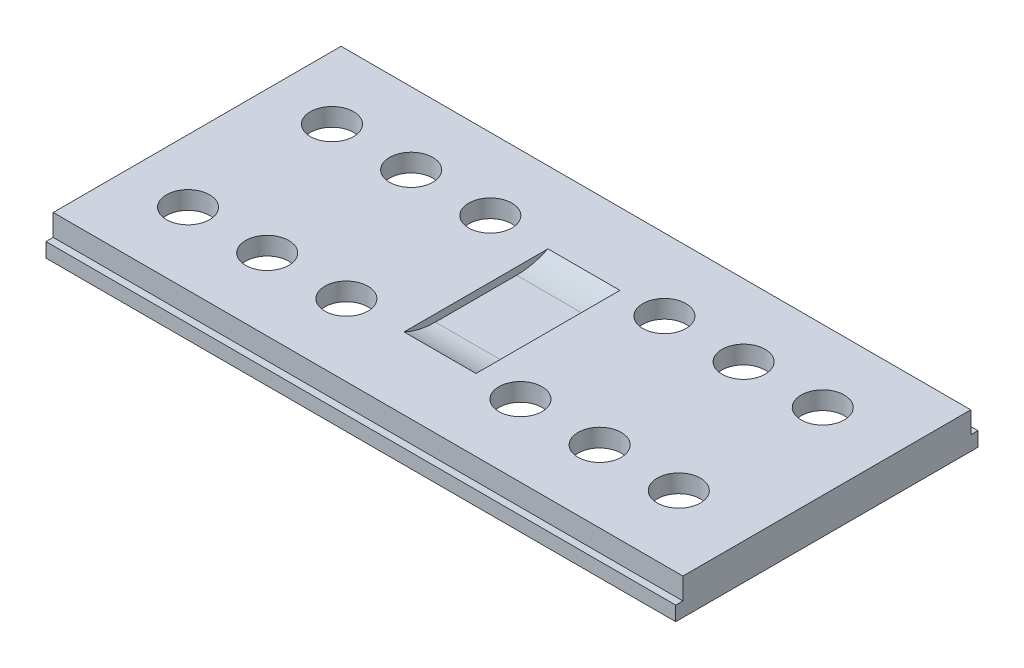
ISO-10303-21;
HEADER;
FILE_DESCRIPTION(('STEP AP214'),'2;1');
FILE_NAME('part.step','',(''),(''),'','','');
FILE_SCHEMA(('AUTOMOTIVE_DESIGN { 1 0 10303 214 1 1 1 1 }'));
ENDSEC;
DATA;
#1=APPLICATION_CONTEXT('core data for automotive mechanical design processes');
#2=APPLICATION_PROTOCOL_DEFINITION('international standard','automotive_design',2000,#1);
#3=PRODUCT_CONTEXT('',#1,'mechanical');
#4=PRODUCT('Part','Part','',(#3));
#5=PRODUCT_RELATED_PRODUCT_CATEGORY('part','',(#4));
#6=PRODUCT_DEFINITION_FORMATION('','',#4);
#7=PRODUCT_DEFINITION_CONTEXT('part definition',#1,'design');
#8=PRODUCT_DEFINITION('design','',#6,#7);
#9=PRODUCT_DEFINITION_SHAPE('','',#8);
#10=(LENGTH_UNIT() NAMED_UNIT(*) SI_UNIT(.MILLI.,.METRE.));
#11=(NAMED_UNIT(*) PLANE_ANGLE_UNIT() SI_UNIT($,.RADIAN.));
#12=(NAMED_UNIT(*) SI_UNIT($,.STERADIAN.) SOLID_ANGLE_UNIT());
#13=UNCERTAINTY_MEASURE_WITH_UNIT(LENGTH_MEASURE(1.E-05),#10,'distance_accuracy_value','');
#14=(GEOMETRIC_REPRESENTATION_CONTEXT(3) GLOBAL_UNCERTAINTY_ASSIGNED_CONTEXT((#13)) GLOBAL_UNIT_ASSIGNED_CONTEXT((#10,
#11,#12)) REPRESENTATION_CONTEXT('',''));
#15=CARTESIAN_POINT('',(0.,0.,0.));
#16=DIRECTION('',(0.,0.,1.));
#17=DIRECTION('',(1.,0.,0.));
#18=AXIS2_PLACEMENT_3D('',#15,#16,#17);
#19=CARTESIAN_POINT('',(33.1768874396976,2.5,-10.));
#20=DIRECTION('',(0.,1.,0.));
#21=DIRECTION('',(0.,0.,1.));
#22=AXIS2_PLACEMENT_3D('',#19,#20,#21);
#23=CYLINDRICAL_SURFACE('',#22,3.);
#24=CARTESIAN_POINT('',(33.1768874396976,2.5,-10.));
#25=DIRECTION('',(0.,1.,0.));
#26=DIRECTION('',(0.,0.,1.));
#27=AXIS2_PLACEMENT_3D('',#24,#25,#26);
#28=CIRCLE('',#27,3.);
#29=CARTESIAN_POINT('',(33.1768874396976,2.5,-7.));
#30=VERTEX_POINT('',#29);
#31=EDGE_CURVE('E41',#30,#30,#28,.T.);
#32=ORIENTED_EDGE('',*,*,#31,.F.);
#33=EDGE_LOOP('',(#32));
#34=FACE_BOUND('',#33,.T.);
#35=CARTESIAN_POINT('',(33.1768874396976,5.,-10.));
#36=DIRECTION('',(0.,1.,0.));
#37=DIRECTION('',(0.,0.,1.));
#38=AXIS2_PLACEMENT_3D('',#35,#36,#37);
#39=CIRCLE('',#38,3.);
#40=CARTESIAN_POINT('',(33.1768874396976,5.,-7.));
#41=VERTEX_POINT('',#40);
#42=EDGE_CURVE('E11',#41,#41,#39,.T.);
#43=ORIENTED_EDGE('',*,*,#42,.T.);
#44=EDGE_LOOP('',(#43));
#45=FACE_BOUND('',#44,.T.);
#46=ADVANCED_FACE('F34',(#34,#45),#23,.F.);
#47=CARTESIAN_POINT('',(33.1768874396976,2.5,10.));
#48=DIRECTION('',(0.,1.,0.));
#49=DIRECTION('',(0.,0.,1.));
#50=AXIS2_PLACEMENT_3D('',#47,#48,#49);
#51=CYLINDRICAL_SURFACE('',#50,3.);
#52=CARTESIAN_POINT('',(33.1768874396976,2.5,10.));
#53=DIRECTION('',(0.,1.,0.));
#54=DIRECTION('',(0.,0.,1.));
#55=AXIS2_PLACEMENT_3D('',#52,#53,#54);
#56=CIRCLE('',#55,3.);
#57=CARTESIAN_POINT('',(33.1768874396976,2.5,13.));
#58=VERTEX_POINT('',#57);
#59=EDGE_CURVE('E331',#58,#58,#56,.T.);
#60=ORIENTED_EDGE('',*,*,#59,.F.);
#61=EDGE_LOOP('',(#60));
#62=FACE_BOUND('',#61,.T.);
#63=CARTESIAN_POINT('',(33.1768874396976,5.,10.));
#64=DIRECTION('',(0.,1.,0.));
#65=DIRECTION('',(0.,0.,1.));
#66=AXIS2_PLACEMENT_3D('',#63,#64,#65);
#67=CIRCLE('',#66,3.);
#68=CARTESIAN_POINT('',(33.1768874396976,5.,13.));
#69=VERTEX_POINT('',#68);
#70=EDGE_CURVE('E334',#69,#69,#67,.T.);
#71=ORIENTED_EDGE('',*,*,#70,.T.);
#72=EDGE_LOOP('',(#71));
#73=FACE_BOUND('',#72,.T.);
#74=ADVANCED_FACE('F342',(#62,#73),#51,.F.);
#75=CARTESIAN_POINT('',(-13.0132960899572,2.5,-10.));
#76=DIRECTION('',(0.,1.,0.));
#77=DIRECTION('',(0.,0.,1.));
#78=AXIS2_PLACEMENT_3D('',#75,#76,#77);
#79=CYLINDRICAL_SURFACE('',#78,3.);
#80=CARTESIAN_POINT('',(-13.0132960899572,2.5,-10.));
#81=DIRECTION('',(0.,1.,0.));
#82=DIRECTION('',(0.,0.,1.));
#83=AXIS2_PLACEMENT_3D('',#80,#81,#82);
#84=CIRCLE('',#83,3.);
#85=CARTESIAN_POINT('',(-13.0132960899572,2.5,-7.));
#86=VERTEX_POINT('',#85);
#87=EDGE_CURVE('E325',#86,#86,#84,.T.);
#88=ORIENTED_EDGE('',*,*,#87,.F.);
#89=EDGE_LOOP('',(#88));
#90=FACE_BOUND('',#89,.T.);
#91=CARTESIAN_POINT('',(-13.0132960899572,5.,-10.));
#92=DIRECTION('',(0.,1.,0.));
#93=DIRECTION('',(0.,0.,1.));
#94=AXIS2_PLACEMENT_3D('',#91,#92,#93);
#95=CIRCLE('',#94,3.);
#96=CARTESIAN_POINT('',(-13.0132960899572,5.,-7.));
#97=VERTEX_POINT('',#96);
#98=EDGE_CURVE('E328',#97,#97,#95,.T.);
#99=ORIENTED_EDGE('',*,*,#98,.T.);
#100=EDGE_LOOP('',(#99));
#101=FACE_BOUND('',#100,.T.);
#102=ADVANCED_FACE('F389',(#90,#101),#79,.F.);
#103=CARTESIAN_POINT('',(-13.0132960899572,2.5,10.));
#104=DIRECTION('',(0.,1.,0.));
#105=DIRECTION('',(0.,0.,1.));
#106=AXIS2_PLACEMENT_3D('',#103,#104,#105);
#107=CYLINDRICAL_SURFACE('',#106,3.);
#108=CARTESIAN_POINT('',(-13.0132960899572,2.5,10.));
#109=DIRECTION('',(0.,1.,0.));
#110=DIRECTION('',(0.,0.,1.));
#111=AXIS2_PLACEMENT_3D('',#108,#109,#110);
#112=CIRCLE('',#111,3.);
#113=CARTESIAN_POINT('',(-13.0132960899572,2.5,13.));
#114=VERTEX_POINT('',#113);
#115=EDGE_CURVE('E319',#114,#114,#112,.T.);
#116=ORIENTED_EDGE('',*,*,#115,.F.);
#117=EDGE_LOOP('',(#116));
#118=FACE_BOUND('',#117,.T.);
#119=CARTESIAN_POINT('',(-13.0132960899572,5.,10.));
#120=DIRECTION('',(0.,1.,0.));
#121=DIRECTION('',(0.,0.,1.));
#122=AXIS2_PLACEMENT_3D('',#119,#120,#121);
#123=CIRCLE('',#122,3.);
#124=CARTESIAN_POINT('',(-13.0132960899572,5.,13.));
#125=VERTEX_POINT('',#124);
#126=EDGE_CURVE('E322',#125,#125,#123,.T.);
#127=ORIENTED_EDGE('',*,*,#126,.T.);
#128=EDGE_LOOP('',(#127));
#129=FACE_BOUND('',#128,.T.);
#130=ADVANCED_FACE('F376',(#118,#129),#107,.F.);
#131=CARTESIAN_POINT('',(43.75,5.,-21.));
#132=DIRECTION('',(-1.,0.,0.));
#133=DIRECTION('',(0.,0.,1.));
#134=AXIS2_PLACEMENT_3D('',#131,#132,#133);
#135=PLANE('',#134);
#136=DIRECTION('',(0.,0.,-1.));
#137=VECTOR('',#136,1.);
#138=CARTESIAN_POINT('',(43.75,5.,-21.));
#139=LINE('',#138,#137);
#140=CARTESIAN_POINT('',(43.75,5.,20.));
#141=VERTEX_POINT('',#140);
#142=CARTESIAN_POINT('',(43.75,5.,-20.));
#143=VERTEX_POINT('',#142);
#144=EDGE_CURVE('E281',#141,#143,#139,.T.);
#145=ORIENTED_EDGE('',*,*,#144,.F.);
#146=DIRECTION('',(0.,1.,0.));
#147=VECTOR('',#146,1.);
#148=CARTESIAN_POINT('',(43.75,2.,20.));
#149=LINE('',#148,#147);
#150=CARTESIAN_POINT('',(43.75,2.,20.));
#151=VERTEX_POINT('',#150);
#152=EDGE_CURVE('E257',#151,#141,#149,.T.);
#153=ORIENTED_EDGE('',*,*,#152,.F.);
#154=DIRECTION('',(0.,0.,-1.));
#155=VECTOR('',#154,1.);
#156=CARTESIAN_POINT('',(43.75,2.,21.));
#157=LINE('',#156,#155);
#158=CARTESIAN_POINT('',(43.75,2.,21.));
#159=VERTEX_POINT('',#158);
#160=EDGE_CURVE('E252',#159,#151,#157,.T.);
#161=ORIENTED_EDGE('',*,*,#160,.F.);
#162=DIRECTION('',(0.,-1.,0.));
#163=VECTOR('',#162,1.);
#164=CARTESIAN_POINT('',(43.75,5.,21.));
#165=LINE('',#164,#163);
#166=CARTESIAN_POINT('',(43.75,0.,21.));
#167=VERTEX_POINT('',#166);
#168=EDGE_CURVE('E287',#159,#167,#165,.T.);
#169=ORIENTED_EDGE('',*,*,#168,.T.);
#170=DIRECTION('',(0.,0.,-1.));
#171=VECTOR('',#170,1.);
#172=CARTESIAN_POINT('',(43.75,0.,-21.));
#173=LINE('',#172,#171);
#174=CARTESIAN_POINT('',(43.75,0.,-21.));
#175=VERTEX_POINT('',#174);
#176=EDGE_CURVE('E279',#167,#175,#173,.T.);
#177=ORIENTED_EDGE('',*,*,#176,.T.);
#178=DIRECTION('',(0.,-1.,0.));
#179=VECTOR('',#178,1.);
#180=CARTESIAN_POINT('',(43.75,5.,-21.));
#181=LINE('',#180,#179);
#182=CARTESIAN_POINT('',(43.75,2.,-21.));
#183=VERTEX_POINT('',#182);
#184=EDGE_CURVE('E303',#183,#175,#181,.T.);
#185=ORIENTED_EDGE('',*,*,#184,.F.);
#186=DIRECTION('',(0.,0.,-1.));
#187=VECTOR('',#186,1.);
#188=CARTESIAN_POINT('',(43.75,2.,-21.));
#189=LINE('',#188,#187);
#190=CARTESIAN_POINT('',(43.75,2.,-20.));
#191=VERTEX_POINT('',#190);
#192=EDGE_CURVE('E264',#191,#183,#189,.T.);
#193=ORIENTED_EDGE('',*,*,#192,.F.);
#194=DIRECTION('',(0.,1.,0.));
#195=VECTOR('',#194,1.);
#196=CARTESIAN_POINT('',(43.75,2.,-20.));
#197=LINE('',#196,#195);
#198=EDGE_CURVE('E276',#191,#143,#197,.T.);
#199=ORIENTED_EDGE('',*,*,#198,.T.);
#200=EDGE_LOOP('',(#145,#153,#161,#169,#177,#185,#193,#199));
#201=FACE_BOUND('',#200,.T.);
#202=ADVANCED_FACE('F372',(#201),#135,.F.);
#203=CARTESIAN_POINT('',(-43.75,5.,-21.));
#204=DIRECTION('',(0.,0.,1.));
#205=DIRECTION('',(1.,0.,0.));
#206=AXIS2_PLACEMENT_3D('',#203,#204,#205);
#207=PLANE('',#206);
#208=DIRECTION('',(0.,-1.,0.));
#209=VECTOR('',#208,1.);
#210=CARTESIAN_POINT('',(-43.75,5.,-21.));
#211=LINE('',#210,#209);
#212=CARTESIAN_POINT('',(-43.75,2.,-21.));
#213=VERTEX_POINT('',#212);
#214=CARTESIAN_POINT('',(-43.75,0.,-21.));
#215=VERTEX_POINT('',#214);
#216=EDGE_CURVE('E301',#213,#215,#211,.T.);
#217=ORIENTED_EDGE('',*,*,#216,.F.);
#218=DIRECTION('',(-1.,0.,0.));
#219=VECTOR('',#218,1.);
#220=CARTESIAN_POINT('',(43.75,2.,-21.));
#221=LINE('',#220,#219);
#222=EDGE_CURVE('E266',#183,#213,#221,.T.);
#223=ORIENTED_EDGE('',*,*,#222,.F.);
#224=ORIENTED_EDGE('',*,*,#184,.T.);
#225=DIRECTION('',(-1.,0.,0.));
#226=VECTOR('',#225,1.);
#227=CARTESIAN_POINT('',(-43.75,0.,-21.));
#228=LINE('',#227,#226);
#229=EDGE_CURVE('E290',#175,#215,#228,.T.);
#230=ORIENTED_EDGE('',*,*,#229,.T.);
#231=EDGE_LOOP('',(#217,#223,#224,#230));
#232=FACE_BOUND('',#231,.T.);
#233=ADVANCED_FACE('F368',(#232),#207,.F.);
#234=CARTESIAN_POINT('',(-43.75,5.,-21.));
#235=DIRECTION('',(1.,0.,0.));
#236=DIRECTION('',(0.,0.,-1.));
#237=AXIS2_PLACEMENT_3D('',#234,#235,#236);
#238=PLANE('',#237);
#239=DIRECTION('',(0.,0.,1.));
#240=VECTOR('',#239,1.);
#241=CARTESIAN_POINT('',(-43.75,2.,21.));
#242=LINE('',#241,#240);
#243=CARTESIAN_POINT('',(-43.75,2.,20.));
#244=VERTEX_POINT('',#243);
#245=CARTESIAN_POINT('',(-43.75,2.,21.));
#246=VERTEX_POINT('',#245);
#247=EDGE_CURVE('E248',#244,#246,#242,.T.);
#248=ORIENTED_EDGE('',*,*,#247,.F.);
#249=DIRECTION('',(0.,1.,0.));
#250=VECTOR('',#249,1.);
#251=CARTESIAN_POINT('',(-43.75,2.,20.));
#252=LINE('',#251,#250);
#253=CARTESIAN_POINT('',(-43.75,5.,20.));
#254=VERTEX_POINT('',#253);
#255=EDGE_CURVE('E259',#244,#254,#252,.T.);
#256=ORIENTED_EDGE('',*,*,#255,.T.);
#257=DIRECTION('',(0.,0.,1.));
#258=VECTOR('',#257,1.);
#259=CARTESIAN_POINT('',(-43.75,5.,-21.));
#260=LINE('',#259,#258);
#261=CARTESIAN_POINT('',(-43.75,5.,-20.));
#262=VERTEX_POINT('',#261);
#263=EDGE_CURVE('E283',#262,#254,#260,.T.);
#264=ORIENTED_EDGE('',*,*,#263,.F.);
#265=DIRECTION('',(0.,1.,0.));
#266=VECTOR('',#265,1.);
#267=CARTESIAN_POINT('',(-43.75,2.,-20.));
#268=LINE('',#267,#266);
#269=CARTESIAN_POINT('',(-43.75,2.,-20.));
#270=VERTEX_POINT('',#269);
#271=EDGE_CURVE('E273',#270,#262,#268,.T.);
#272=ORIENTED_EDGE('',*,*,#271,.F.);
#273=DIRECTION('',(0.,0.,1.));
#274=VECTOR('',#273,1.);
#275=CARTESIAN_POINT('',(-43.75,2.,-21.));
#276=LINE('',#275,#274);
#277=EDGE_CURVE('E268',#213,#270,#276,.T.);
#278=ORIENTED_EDGE('',*,*,#277,.F.);
#279=ORIENTED_EDGE('',*,*,#216,.T.);
#280=DIRECTION('',(0.,0.,1.));
#281=VECTOR('',#280,1.);
#282=CARTESIAN_POINT('',(-43.75,0.,-21.));
#283=LINE('',#282,#281);
#284=CARTESIAN_POINT('',(-43.75,0.,21.));
#285=VERTEX_POINT('',#284);
#286=EDGE_CURVE('E293',#215,#285,#283,.T.);
#287=ORIENTED_EDGE('',*,*,#286,.T.);
#288=DIRECTION('',(0.,-1.,0.));
#289=VECTOR('',#288,1.);
#290=CARTESIAN_POINT('',(-43.75,5.,21.));
#291=LINE('',#290,#289);
#292=EDGE_CURVE('E299',#246,#285,#291,.T.);
#293=ORIENTED_EDGE('',*,*,#292,.F.);
#294=EDGE_LOOP('',(#248,#256,#264,#272,#278,#279,#287,#293));
#295=FACE_BOUND('',#294,.T.);
#296=ADVANCED_FACE('F358',(#295),#238,.F.);
#297=CARTESIAN_POINT('',(-43.75,5.,21.));
#298=DIRECTION('',(0.,0.,-1.));
#299=DIRECTION('',(-1.,0.,0.));
#300=AXIS2_PLACEMENT_3D('',#297,#298,#299);
#301=PLANE('',#300);
#302=ORIENTED_EDGE('',*,*,#168,.F.);
#303=DIRECTION('',(1.,0.,0.));
#304=VECTOR('',#303,1.);
#305=CARTESIAN_POINT('',(-43.75,2.,21.));
#306=LINE('',#305,#304);
#307=EDGE_CURVE('E250',#246,#159,#306,.T.);
#308=ORIENTED_EDGE('',*,*,#307,.F.);
#309=ORIENTED_EDGE('',*,*,#292,.T.);
#310=DIRECTION('',(1.,0.,0.));
#311=VECTOR('',#310,1.);
#312=CARTESIAN_POINT('',(-43.75,0.,21.));
#313=LINE('',#312,#311);
#314=EDGE_CURVE('E284',#285,#167,#313,.T.);
#315=ORIENTED_EDGE('',*,*,#314,.T.);
#316=EDGE_LOOP('',(#302,#308,#309,#315));
#317=FACE_BOUND('',#316,.T.);
#318=ADVANCED_FACE('F348',(#317),#301,.F.);
#319=CARTESIAN_POINT('',(0.,5.,0.));
#320=DIRECTION('',(0.,1.,0.));
#321=DIRECTION('',(0.,0.,1.));
#322=AXIS2_PLACEMENT_3D('',#319,#320,#321);
#323=PLANE('',#322);
#324=CARTESIAN_POINT('',(22.1768874396976,5.,-10.));
#325=DIRECTION('',(0.,1.,0.));
#326=DIRECTION('',(0.,0.,1.));
#327=AXIS2_PLACEMENT_3D('',#324,#325,#326);
#328=CIRCLE('',#327,3.);
#329=CARTESIAN_POINT('',(22.1768874396976,5.,-7.));
#330=VERTEX_POINT('',#329);
#331=EDGE_CURVE('E840',#330,#330,#328,.T.);
#332=ORIENTED_EDGE('',*,*,#331,.F.);
#333=EDGE_LOOP('',(#332));
#334=FACE_BOUND('',#333,.T.);
#335=CARTESIAN_POINT('',(22.1768874396976,5.,10.));
#336=DIRECTION('',(0.,1.,0.));
#337=DIRECTION('',(0.,0.,1.));
#338=AXIS2_PLACEMENT_3D('',#335,#336,#337);
#339=CIRCLE('',#338,3.);
#340=CARTESIAN_POINT('',(22.1768874396976,5.,13.));
#341=VERTEX_POINT('',#340);
#342=EDGE_CURVE('E834',#341,#341,#339,.T.);
#343=ORIENTED_EDGE('',*,*,#342,.F.);
#344=EDGE_LOOP('',(#343));
#345=FACE_BOUND('',#344,.T.);
#346=CARTESIAN_POINT('',(-24.0132960899572,5.,-10.));
#347=DIRECTION('',(0.,1.,0.));
#348=DIRECTION('',(0.,0.,1.));
#349=AXIS2_PLACEMENT_3D('',#346,#347,#348);
#350=CIRCLE('',#349,3.);
#351=CARTESIAN_POINT('',(-24.0132960899572,5.,-7.));
#352=VERTEX_POINT('',#351);
#353=EDGE_CURVE('E828',#352,#352,#350,.T.);
#354=ORIENTED_EDGE('',*,*,#353,.F.);
#355=EDGE_LOOP('',(#354));
#356=FACE_BOUND('',#355,.T.);
#357=CARTESIAN_POINT('',(-24.0132960899572,5.,10.));
#358=DIRECTION('',(0.,1.,0.));
#359=DIRECTION('',(0.,0.,1.));
#360=AXIS2_PLACEMENT_3D('',#357,#358,#359);
#361=CIRCLE('',#360,3.);
#362=CARTESIAN_POINT('',(-24.0132960899572,5.,13.));
#363=VERTEX_POINT('',#362);
#364=EDGE_CURVE('E820',#363,#363,#361,.T.);
#365=ORIENTED_EDGE('',*,*,#364,.F.);
#366=EDGE_LOOP('',(#365));
#367=FACE_BOUND('',#366,.T.);
#368=CARTESIAN_POINT('',(-35.0132960899572,5.,10.));
#369=DIRECTION('',(0.,1.,0.));
#370=DIRECTION('',(0.,0.,1.));
#371=AXIS2_PLACEMENT_3D('',#368,#369,#370);
#372=CIRCLE('',#371,3.);
#373=CARTESIAN_POINT('',(-35.0132960899572,5.,13.));
#374=VERTEX_POINT('',#373);
#375=EDGE_CURVE('E785',#374,#374,#372,.T.);
#376=ORIENTED_EDGE('',*,*,#375,.F.);
#377=EDGE_LOOP('',(#376));
#378=FACE_BOUND('',#377,.T.);
#379=CARTESIAN_POINT('',(11.1768874396976,5.,-10.));
#380=DIRECTION('',(0.,1.,0.));
#381=DIRECTION('',(0.,0.,1.));
#382=AXIS2_PLACEMENT_3D('',#379,#380,#381);
#383=CIRCLE('',#382,3.);
#384=CARTESIAN_POINT('',(11.1768874396976,5.,-7.));
#385=VERTEX_POINT('',#384);
#386=EDGE_CURVE('E808',#385,#385,#383,.T.);
#387=ORIENTED_EDGE('',*,*,#386,.F.);
#388=EDGE_LOOP('',(#387));
#389=FACE_BOUND('',#388,.T.);
#390=CARTESIAN_POINT('',(11.1768874396976,5.,10.));
#391=DIRECTION('',(0.,1.,0.));
#392=DIRECTION('',(0.,0.,1.));
#393=AXIS2_PLACEMENT_3D('',#390,#391,#392);
#394=CIRCLE('',#393,3.);
#395=CARTESIAN_POINT('',(11.1768874396976,5.,13.));
#396=VERTEX_POINT('',#395);
#397=EDGE_CURVE('E817',#396,#396,#394,.T.);
#398=ORIENTED_EDGE('',*,*,#397,.F.);
#399=EDGE_LOOP('',(#398));
#400=FACE_BOUND('',#399,.T.);
#401=CARTESIAN_POINT('',(-35.0132960899572,5.,-10.));
#402=DIRECTION('',(0.,1.,0.));
#403=DIRECTION('',(0.,0.,1.));
#404=AXIS2_PLACEMENT_3D('',#401,#402,#403);
#405=CIRCLE('',#404,3.);
#406=CARTESIAN_POINT('',(-35.0132960899572,5.,-7.));
#407=VERTEX_POINT('',#406);
#408=EDGE_CURVE('E778',#407,#407,#405,.T.);
#409=ORIENTED_EDGE('',*,*,#408,.F.);
#410=EDGE_LOOP('',(#409));
#411=FACE_BOUND('',#410,.T.);
#412=DIRECTION('',(0.,0.,-1.));
#413=VECTOR('',#412,1.);
#414=CARTESIAN_POINT('',(5.,5.,-10.));
#415=LINE('',#414,#413);
#416=CARTESIAN_POINT('',(5.,5.,10.));
#417=VERTEX_POINT('',#416);
#418=CARTESIAN_POINT('',(5.,5.,-10.));
#419=VERTEX_POINT('',#418);
#420=EDGE_CURVE('E233',#417,#419,#415,.T.);
#421=ORIENTED_EDGE('',*,*,#420,.F.);
#422=DIRECTION('',(1.,0.,0.));
#423=VECTOR('',#422,1.);
#424=CARTESIAN_POINT('',(-5.,5.,10.));
#425=LINE('',#424,#423);
#426=CARTESIAN_POINT('',(-5.,5.,10.));
#427=VERTEX_POINT('',#426);
#428=EDGE_CURVE('E237',#427,#417,#425,.T.);
#429=ORIENTED_EDGE('',*,*,#428,.F.);
#430=DIRECTION('',(0.,0.,1.));
#431=VECTOR('',#430,1.);
#432=CARTESIAN_POINT('',(-5.,5.,-10.));
#433=LINE('',#432,#431);
#434=CARTESIAN_POINT('',(-5.,5.,-10.));
#435=VERTEX_POINT('',#434);
#436=EDGE_CURVE('E244',#435,#427,#433,.T.);
#437=ORIENTED_EDGE('',*,*,#436,.F.);
#438=DIRECTION('',(-1.,0.,0.));
#439=VECTOR('',#438,1.);
#440=CARTESIAN_POINT('',(-5.,5.,-10.));
#441=LINE('',#440,#439);
#442=EDGE_CURVE('E241',#419,#435,#441,.T.);
#443=ORIENTED_EDGE('',*,*,#442,.F.);
#444=EDGE_LOOP('',(#421,#429,#437,#443));
#445=FACE_BOUND('',#444,.T.);
#446=DIRECTION('',(-1.,0.,0.));
#447=VECTOR('',#446,1.);
#448=CARTESIAN_POINT('',(-43.75,5.,20.));
#449=LINE('',#448,#447);
#450=EDGE_CURVE('E239',#141,#254,#449,.T.);
#451=ORIENTED_EDGE('',*,*,#450,.F.);
#452=ORIENTED_EDGE('',*,*,#144,.T.);
#453=DIRECTION('',(1.,0.,0.));
#454=VECTOR('',#453,1.);
#455=CARTESIAN_POINT('',(43.75,5.,-20.));
#456=LINE('',#455,#454);
#457=EDGE_CURVE('E262',#262,#143,#456,.T.);
#458=ORIENTED_EDGE('',*,*,#457,.F.);
#459=ORIENTED_EDGE('',*,*,#263,.T.);
#460=EDGE_LOOP('',(#451,#452,#458,#459));
#461=FACE_BOUND('',#460,.T.);
#462=ORIENTED_EDGE('',*,*,#126,.F.);
#463=EDGE_LOOP('',(#462));
#464=FACE_BOUND('',#463,.T.);
#465=ORIENTED_EDGE('',*,*,#98,.F.);
#466=EDGE_LOOP('',(#465));
#467=FACE_BOUND('',#466,.T.);
#468=ORIENTED_EDGE('',*,*,#70,.F.);
#469=EDGE_LOOP('',(#468));
#470=FACE_BOUND('',#469,.T.);
#471=ORIENTED_EDGE('',*,*,#42,.F.);
#472=EDGE_LOOP('',(#471));
#473=FACE_BOUND('',#472,.T.);
#474=ADVANCED_FACE('F345',(#334,#345,#356,#367,#378,#389,#400,#411,#445,#461,#464,#467,#470,
#473),#323,.T.);
#475=CARTESIAN_POINT('',(0.,0.,0.));
#476=DIRECTION('',(0.,1.,0.));
#477=DIRECTION('',(0.,0.,1.));
#478=AXIS2_PLACEMENT_3D('',#475,#476,#477);
#479=PLANE('',#478);
#480=DIRECTION('',(1.,0.,0.));
#481=VECTOR('',#480,1.);
#482=CARTESIAN_POINT('',(0.,0.,-17.5));
#483=LINE('',#482,#481);
#484=CARTESIAN_POINT('',(-41.25,0.,-17.5));
#485=VERTEX_POINT('',#484);
#486=CARTESIAN_POINT('',(41.25,0.,-17.5));
#487=VERTEX_POINT('',#486);
#488=EDGE_CURVE('E179',#485,#487,#483,.T.);
#489=ORIENTED_EDGE('',*,*,#488,.F.);
#490=DIRECTION('',(0.,0.,1.));
#491=VECTOR('',#490,1.);
#492=CARTESIAN_POINT('',(-41.25,0.,-21.));
#493=LINE('',#492,#491);
#494=CARTESIAN_POINT('',(-41.25,0.,17.5));
#495=VERTEX_POINT('',#494);
#496=EDGE_CURVE('E191',#485,#495,#493,.T.);
#497=ORIENTED_EDGE('',*,*,#496,.T.);
#498=DIRECTION('',(1.,0.,0.));
#499=VECTOR('',#498,1.);
#500=CARTESIAN_POINT('',(-43.75,0.,17.5));
#501=LINE('',#500,#499);
#502=CARTESIAN_POINT('',(41.25,0.,17.5));
#503=VERTEX_POINT('',#502);
#504=EDGE_CURVE('E206',#495,#503,#501,.T.);
#505=ORIENTED_EDGE('',*,*,#504,.T.);
#506=DIRECTION('',(0.,0.,-1.));
#507=VECTOR('',#506,1.);
#508=CARTESIAN_POINT('',(41.25,0.,-21.));
#509=LINE('',#508,#507);
#510=EDGE_CURVE('E182',#503,#487,#509,.T.);
#511=ORIENTED_EDGE('',*,*,#510,.T.);
#512=EDGE_LOOP('',(#489,#497,#505,#511));
#513=FACE_BOUND('',#512,.T.);
#514=ORIENTED_EDGE('',*,*,#176,.F.);
#515=ORIENTED_EDGE('',*,*,#314,.F.);
#516=ORIENTED_EDGE('',*,*,#286,.F.);
#517=ORIENTED_EDGE('',*,*,#229,.F.);
#518=EDGE_LOOP('',(#514,#515,#516,#517));
#519=FACE_BOUND('',#518,.T.);
#520=ADVANCED_FACE('F347',(#513,#519),#479,.F.);
#521=CARTESIAN_POINT('',(43.75,2.,-20.));
#522=DIRECTION('',(0.,0.,1.));
#523=DIRECTION('',(1.,0.,0.));
#524=AXIS2_PLACEMENT_3D('',#521,#522,#523);
#525=PLANE('',#524);
#526=ORIENTED_EDGE('',*,*,#457,.T.);
#527=ORIENTED_EDGE('',*,*,#198,.F.);
#528=DIRECTION('',(1.,0.,0.));
#529=VECTOR('',#528,1.);
#530=CARTESIAN_POINT('',(43.75,2.,-20.));
#531=LINE('',#530,#529);
#532=EDGE_CURVE('E270',#270,#191,#531,.T.);
#533=ORIENTED_EDGE('',*,*,#532,.F.);
#534=ORIENTED_EDGE('',*,*,#271,.T.);
#535=EDGE_LOOP('',(#526,#527,#533,#534));
#536=FACE_BOUND('',#535,.T.);
#537=ADVANCED_FACE('F355',(#536),#525,.F.);
#538=CARTESIAN_POINT('',(0.,2.,0.));
#539=DIRECTION('',(0.,-1.,0.));
#540=DIRECTION('',(0.,0.,-1.));
#541=AXIS2_PLACEMENT_3D('',#538,#539,#540);
#542=PLANE('',#541);
#543=ORIENTED_EDGE('',*,*,#192,.T.);
#544=ORIENTED_EDGE('',*,*,#222,.T.);
#545=ORIENTED_EDGE('',*,*,#277,.T.);
#546=ORIENTED_EDGE('',*,*,#532,.T.);
#547=EDGE_LOOP('',(#543,#544,#545,#546));
#548=FACE_BOUND('',#547,.T.);
#549=ADVANCED_FACE('F457',(#548),#542,.F.);
#550=CARTESIAN_POINT('',(-43.75,2.,20.));
#551=DIRECTION('',(0.,0.,-1.));
#552=DIRECTION('',(-1.,0.,0.));
#553=AXIS2_PLACEMENT_3D('',#550,#551,#552);
#554=PLANE('',#553);
#555=ORIENTED_EDGE('',*,*,#450,.T.);
#556=ORIENTED_EDGE('',*,*,#255,.F.);
#557=DIRECTION('',(-1.,0.,0.));
#558=VECTOR('',#557,1.);
#559=CARTESIAN_POINT('',(-43.75,2.,20.));
#560=LINE('',#559,#558);
#561=EDGE_CURVE('E254',#151,#244,#560,.T.);
#562=ORIENTED_EDGE('',*,*,#561,.F.);
#563=ORIENTED_EDGE('',*,*,#152,.T.);
#564=EDGE_LOOP('',(#555,#556,#562,#563));
#565=FACE_BOUND('',#564,.T.);
#566=ADVANCED_FACE('F454',(#565),#554,.F.);
#567=CARTESIAN_POINT('',(0.,2.,0.));
#568=DIRECTION('',(0.,-1.,0.));
#569=DIRECTION('',(0.,0.,-1.));
#570=AXIS2_PLACEMENT_3D('',#567,#568,#569);
#571=PLANE('',#570);
#572=ORIENTED_EDGE('',*,*,#247,.T.);
#573=ORIENTED_EDGE('',*,*,#307,.T.);
#574=ORIENTED_EDGE('',*,*,#160,.T.);
#575=ORIENTED_EDGE('',*,*,#561,.T.);
#576=EDGE_LOOP('',(#572,#573,#574,#575));
#577=FACE_BOUND('',#576,.T.);
#578=ADVANCED_FACE('F451',(#577),#571,.F.);
#579=CARTESIAN_POINT('',(5.,4.,-10.));
#580=DIRECTION('',(1.,0.,0.));
#581=DIRECTION('',(0.,0.,-1.));
#582=AXIS2_PLACEMENT_3D('',#579,#580,#581);
#583=PLANE('',#582);
#584=ORIENTED_EDGE('',*,*,#420,.T.);
#585=CARTESIAN_POINT('',(5.,14.,-5.64110105645933));
#586=DIRECTION('',(1.,0.,0.));
#587=DIRECTION('',(0.,0.,-1.));
#588=AXIS2_PLACEMENT_3D('',#585,#586,#587);
#589=CIRCLE('',#588,10.);
#590=CARTESIAN_POINT('',(5.,4.,-5.64110105645933));
#591=VERTEX_POINT('',#590);
#592=EDGE_CURVE('E56',#419,#591,#589,.F.);
#593=ORIENTED_EDGE('',*,*,#592,.T.);
#594=DIRECTION('',(0.,0.,-1.));
#595=VECTOR('',#594,1.);
#596=CARTESIAN_POINT('',(5.,4.,-10.));
#597=LINE('',#596,#595);
#598=CARTESIAN_POINT('',(5.,4.,5.64110105645933));
#599=VERTEX_POINT('',#598);
#600=EDGE_CURVE('E234',#599,#591,#597,.T.);
#601=ORIENTED_EDGE('',*,*,#600,.F.);
#602=CARTESIAN_POINT('',(5.,14.,5.64110105645933));
#603=DIRECTION('',(1.,0.,0.));
#604=DIRECTION('',(0.,0.,-1.));
#605=AXIS2_PLACEMENT_3D('',#602,#603,#604);
#606=CIRCLE('',#605,10.);
#607=EDGE_CURVE('E308',#599,#417,#606,.F.);
#608=ORIENTED_EDGE('',*,*,#607,.T.);
#609=EDGE_LOOP('',(#584,#593,#601,#608));
#610=FACE_BOUND('',#609,.T.);
#611=ADVANCED_FACE('F447',(#610),#583,.F.);
#612=CARTESIAN_POINT('',(-5.,4.,-10.));
#613=DIRECTION('',(-1.,0.,0.));
#614=DIRECTION('',(0.,0.,1.));
#615=AXIS2_PLACEMENT_3D('',#612,#613,#614);
#616=PLANE('',#615);
#617=DIRECTION('',(0.,0.,1.));
#618=VECTOR('',#617,1.);
#619=CARTESIAN_POINT('',(-5.,4.,-10.));
#620=LINE('',#619,#618);
#621=CARTESIAN_POINT('',(-5.,4.,-5.64110105645933));
#622=VERTEX_POINT('',#621);
#623=CARTESIAN_POINT('',(-5.,4.,5.64110105645933));
#624=VERTEX_POINT('',#623);
#625=EDGE_CURVE('E236',#622,#624,#620,.T.);
#626=ORIENTED_EDGE('',*,*,#625,.F.);
#627=CARTESIAN_POINT('',(-5.,14.,-5.64110105645933));
#628=DIRECTION('',(-1.,0.,0.));
#629=DIRECTION('',(0.,0.,1.));
#630=AXIS2_PLACEMENT_3D('',#627,#628,#629);
#631=CIRCLE('',#630,10.);
#632=EDGE_CURVE('E316',#622,#435,#631,.F.);
#633=ORIENTED_EDGE('',*,*,#632,.T.);
#634=ORIENTED_EDGE('',*,*,#436,.T.);
#635=CARTESIAN_POINT('',(-5.,14.,5.64110105645933));
#636=DIRECTION('',(-1.,0.,0.));
#637=DIRECTION('',(0.,0.,1.));
#638=AXIS2_PLACEMENT_3D('',#635,#636,#637);
#639=CIRCLE('',#638,10.);
#640=EDGE_CURVE('E310',#427,#624,#639,.F.);
#641=ORIENTED_EDGE('',*,*,#640,.T.);
#642=EDGE_LOOP('',(#626,#633,#634,#641));
#643=FACE_BOUND('',#642,.T.);
#644=ADVANCED_FACE('F443',(#643),#616,.F.);
#645=CARTESIAN_POINT('',(0.,4.,0.));
#646=DIRECTION('',(0.,1.,0.));
#647=DIRECTION('',(0.,0.,1.));
#648=AXIS2_PLACEMENT_3D('',#645,#646,#647);
#649=PLANE('',#648);
#650=ORIENTED_EDGE('',*,*,#600,.T.);
#651=DIRECTION('',(-1.,0.,0.));
#652=VECTOR('',#651,1.);
#653=CARTESIAN_POINT('',(-5.,4.,-5.64110105645933));
#654=LINE('',#653,#652);
#655=EDGE_CURVE('E313',#591,#622,#654,.T.);
#656=ORIENTED_EDGE('',*,*,#655,.T.);
#657=ORIENTED_EDGE('',*,*,#625,.T.);
#658=DIRECTION('',(1.,0.,0.));
#659=VECTOR('',#658,1.);
#660=CARTESIAN_POINT('',(5.,4.,5.64110105645933));
#661=LINE('',#660,#659);
#662=EDGE_CURVE('E305',#624,#599,#661,.T.);
#663=ORIENTED_EDGE('',*,*,#662,.T.);
#664=EDGE_LOOP('',(#650,#656,#657,#663));
#665=FACE_BOUND('',#664,.T.);
#666=ADVANCED_FACE('F382',(#665),#649,.T.);
#667=CARTESIAN_POINT('',(-5.,14.,5.64110105645933));
#668=DIRECTION('',(-1.,0.,0.));
#669=DIRECTION('',(0.,0.,1.));
#670=AXIS2_PLACEMENT_3D('',#667,#668,#669);
#671=CYLINDRICAL_SURFACE('',#670,10.);
#672=ORIENTED_EDGE('',*,*,#640,.F.);
#673=ORIENTED_EDGE('',*,*,#428,.T.);
#674=ORIENTED_EDGE('',*,*,#607,.F.);
#675=ORIENTED_EDGE('',*,*,#662,.F.);
#676=EDGE_LOOP('',(#672,#673,#674,#675));
#677=FACE_BOUND('',#676,.T.);
#678=ADVANCED_FACE('F378',(#677),#671,.F.);
#679=CARTESIAN_POINT('',(-5.,14.,-5.64110105645933));
#680=DIRECTION('',(1.,0.,0.));
#681=DIRECTION('',(0.,0.,-1.));
#682=AXIS2_PLACEMENT_3D('',#679,#680,#681);
#683=CYLINDRICAL_SURFACE('',#682,10.);
#684=ORIENTED_EDGE('',*,*,#592,.F.);
#685=ORIENTED_EDGE('',*,*,#442,.T.);
#686=ORIENTED_EDGE('',*,*,#632,.F.);
#687=ORIENTED_EDGE('',*,*,#655,.F.);
#688=EDGE_LOOP('',(#684,#685,#686,#687));
#689=FACE_BOUND('',#688,.T.);
#690=ADVANCED_FACE('F381',(#689),#683,.F.);
#691=CARTESIAN_POINT('',(41.25,5.,-21.));
#692=DIRECTION('',(-1.,0.,0.));
#693=DIRECTION('',(0.,0.,1.));
#694=AXIS2_PLACEMENT_3D('',#691,#692,#693);
#695=PLANE('',#694);
#696=DIRECTION('',(0.,0.,-1.));
#697=VECTOR('',#696,1.);
#698=CARTESIAN_POINT('',(41.25,2.5,-21.));
#699=LINE('',#698,#697);
#700=CARTESIAN_POINT('',(41.25,2.5,17.5));
#701=VERTEX_POINT('',#700);
#702=CARTESIAN_POINT('',(41.25,2.5,-17.5));
#703=VERTEX_POINT('',#702);
#704=EDGE_CURVE('E186',#701,#703,#699,.T.);
#705=ORIENTED_EDGE('',*,*,#704,.T.);
#706=DIRECTION('',(0.,1.,0.));
#707=VECTOR('',#706,1.);
#708=CARTESIAN_POINT('',(41.25,5.,-17.5));
#709=LINE('',#708,#707);
#710=EDGE_CURVE('E171',#487,#703,#709,.T.);
#711=ORIENTED_EDGE('',*,*,#710,.F.);
#712=ORIENTED_EDGE('',*,*,#510,.F.);
#713=DIRECTION('',(0.,1.,0.));
#714=VECTOR('',#713,1.);
#715=CARTESIAN_POINT('',(41.25,2.,17.5));
#716=LINE('',#715,#714);
#717=EDGE_CURVE('E48',#503,#701,#716,.T.);
#718=ORIENTED_EDGE('',*,*,#717,.T.);
#719=EDGE_LOOP('',(#705,#711,#712,#718));
#720=FACE_BOUND('',#719,.T.);
#721=ADVANCED_FACE('F187',(#720),#695,.T.);
#722=CARTESIAN_POINT('',(-41.25,5.,-21.));
#723=DIRECTION('',(1.,0.,0.));
#724=DIRECTION('',(0.,0.,-1.));
#725=AXIS2_PLACEMENT_3D('',#722,#723,#724);
#726=PLANE('',#725);
#727=ORIENTED_EDGE('',*,*,#496,.F.);
#728=DIRECTION('',(0.,1.,0.));
#729=VECTOR('',#728,1.);
#730=CARTESIAN_POINT('',(-41.25,2.,-17.5));
#731=LINE('',#730,#729);
#732=CARTESIAN_POINT('',(-41.25,2.5,-17.5));
#733=VERTEX_POINT('',#732);
#734=EDGE_CURVE('E183',#485,#733,#731,.T.);
#735=ORIENTED_EDGE('',*,*,#734,.T.);
#736=DIRECTION('',(0.,0.,1.));
#737=VECTOR('',#736,1.);
#738=CARTESIAN_POINT('',(-41.25,2.5,-21.));
#739=LINE('',#738,#737);
#740=CARTESIAN_POINT('',(-41.25,2.5,17.5));
#741=VERTEX_POINT('',#740);
#742=EDGE_CURVE('E190',#733,#741,#739,.T.);
#743=ORIENTED_EDGE('',*,*,#742,.T.);
#744=DIRECTION('',(0.,1.,0.));
#745=VECTOR('',#744,1.);
#746=CARTESIAN_POINT('',(-41.25,5.,17.5));
#747=LINE('',#746,#745);
#748=EDGE_CURVE('E196',#495,#741,#747,.T.);
#749=ORIENTED_EDGE('',*,*,#748,.F.);
#750=EDGE_LOOP('',(#727,#735,#743,#749));
#751=FACE_BOUND('',#750,.T.);
#752=ADVANCED_FACE('F403',(#751),#726,.T.);
#753=CARTESIAN_POINT('',(0.,2.5,0.));
#754=DIRECTION('',(0.,1.,0.));
#755=DIRECTION('',(0.,0.,1.));
#756=AXIS2_PLACEMENT_3D('',#753,#754,#755);
#757=PLANE('',#756);
#758=CARTESIAN_POINT('',(22.1768874396976,2.5,-10.));
#759=DIRECTION('',(0.,1.,0.));
#760=DIRECTION('',(0.,0.,1.));
#761=AXIS2_PLACEMENT_3D('',#758,#759,#760);
#762=CIRCLE('',#761,3.);
#763=CARTESIAN_POINT('',(22.1768874396976,2.5,-7.));
#764=VERTEX_POINT('',#763);
#765=EDGE_CURVE('E843',#764,#764,#762,.T.);
#766=ORIENTED_EDGE('',*,*,#765,.T.);
#767=EDGE_LOOP('',(#766));
#768=FACE_BOUND('',#767,.T.);
#769=CARTESIAN_POINT('',(22.1768874396976,2.5,10.));
#770=DIRECTION('',(0.,1.,0.));
#771=DIRECTION('',(0.,0.,1.));
#772=AXIS2_PLACEMENT_3D('',#769,#770,#771);
#773=CIRCLE('',#772,3.);
#774=CARTESIAN_POINT('',(22.1768874396976,2.5,13.));
#775=VERTEX_POINT('',#774);
#776=EDGE_CURVE('E837',#775,#775,#773,.T.);
#777=ORIENTED_EDGE('',*,*,#776,.T.);
#778=EDGE_LOOP('',(#777));
#779=FACE_BOUND('',#778,.T.);
#780=CARTESIAN_POINT('',(-24.0132960899572,2.5,-10.));
#781=DIRECTION('',(0.,1.,0.));
#782=DIRECTION('',(0.,0.,1.));
#783=AXIS2_PLACEMENT_3D('',#780,#781,#782);
#784=CIRCLE('',#783,3.);
#785=CARTESIAN_POINT('',(-24.0132960899572,2.5,-7.));
#786=VERTEX_POINT('',#785);
#787=EDGE_CURVE('E831',#786,#786,#784,.T.);
#788=ORIENTED_EDGE('',*,*,#787,.T.);
#789=EDGE_LOOP('',(#788));
#790=FACE_BOUND('',#789,.T.);
#791=CARTESIAN_POINT('',(-24.0132960899572,2.5,10.));
#792=DIRECTION('',(0.,1.,0.));
#793=DIRECTION('',(0.,0.,1.));
#794=AXIS2_PLACEMENT_3D('',#791,#792,#793);
#795=CIRCLE('',#794,3.);
#796=CARTESIAN_POINT('',(-24.0132960899572,2.5,13.));
#797=VERTEX_POINT('',#796);
#798=EDGE_CURVE('E825',#797,#797,#795,.T.);
#799=ORIENTED_EDGE('',*,*,#798,.T.);
#800=EDGE_LOOP('',(#799));
#801=FACE_BOUND('',#800,.T.);
#802=CARTESIAN_POINT('',(-35.0132960899572,2.5,10.));
#803=DIRECTION('',(0.,1.,0.));
#804=DIRECTION('',(0.,0.,1.));
#805=AXIS2_PLACEMENT_3D('',#802,#803,#804);
#806=CIRCLE('',#805,3.);
#807=CARTESIAN_POINT('',(-35.0132960899572,2.5,13.));
#808=VERTEX_POINT('',#807);
#809=EDGE_CURVE('E780',#808,#808,#806,.T.);
#810=ORIENTED_EDGE('',*,*,#809,.T.);
#811=EDGE_LOOP('',(#810));
#812=FACE_BOUND('',#811,.T.);
#813=CARTESIAN_POINT('',(11.1768874396976,2.5,-10.));
#814=DIRECTION('',(0.,1.,0.));
#815=DIRECTION('',(0.,0.,1.));
#816=AXIS2_PLACEMENT_3D('',#813,#814,#815);
#817=CIRCLE('',#816,3.);
#818=CARTESIAN_POINT('',(11.1768874396976,2.5,-7.));
#819=VERTEX_POINT('',#818);
#820=EDGE_CURVE('E811',#819,#819,#817,.T.);
#821=ORIENTED_EDGE('',*,*,#820,.T.);
#822=EDGE_LOOP('',(#821));
#823=FACE_BOUND('',#822,.T.);
#824=CARTESIAN_POINT('',(11.1768874396976,2.5,10.));
#825=DIRECTION('',(0.,1.,0.));
#826=DIRECTION('',(0.,0.,1.));
#827=AXIS2_PLACEMENT_3D('',#824,#825,#826);
#828=CIRCLE('',#827,3.);
#829=CARTESIAN_POINT('',(11.1768874396976,2.5,13.));
#830=VERTEX_POINT('',#829);
#831=EDGE_CURVE('E812',#830,#830,#828,.T.);
#832=ORIENTED_EDGE('',*,*,#831,.T.);
#833=EDGE_LOOP('',(#832));
#834=FACE_BOUND('',#833,.T.);
#835=CARTESIAN_POINT('',(-35.0132960899572,2.5,-10.));
#836=DIRECTION('',(0.,1.,0.));
#837=DIRECTION('',(0.,0.,1.));
#838=AXIS2_PLACEMENT_3D('',#835,#836,#837);
#839=CIRCLE('',#838,3.);
#840=CARTESIAN_POINT('',(-35.0132960899572,2.5,-7.));
#841=VERTEX_POINT('',#840);
#842=EDGE_CURVE('E775',#841,#841,#839,.T.);
#843=ORIENTED_EDGE('',*,*,#842,.T.);
#844=EDGE_LOOP('',(#843));
#845=FACE_BOUND('',#844,.T.);
#846=DIRECTION('',(0.,0.,-1.));
#847=VECTOR('',#846,1.);
#848=CARTESIAN_POINT('',(7.5,2.5,0.));
#849=LINE('',#848,#847);
#850=CARTESIAN_POINT('',(7.5,2.5,10.5400805420257));
#851=VERTEX_POINT('',#850);
#852=CARTESIAN_POINT('',(7.5,2.5,-10.5400805420257));
#853=VERTEX_POINT('',#852);
#854=EDGE_CURVE('E782',#851,#853,#849,.T.);
#855=ORIENTED_EDGE('',*,*,#854,.T.);
#856=DIRECTION('',(1.,0.,0.));
#857=VECTOR('',#856,1.);
#858=CARTESIAN_POINT('',(7.5,2.5,-10.5400805420257));
#859=LINE('',#858,#857);
#860=CARTESIAN_POINT('',(-7.5,2.5,-10.5400805420257));
#861=VERTEX_POINT('',#860);
#862=EDGE_CURVE('E202',#853,#861,#859,.F.);
#863=ORIENTED_EDGE('',*,*,#862,.T.);
#864=DIRECTION('',(0.,0.,1.));
#865=VECTOR('',#864,1.);
#866=CARTESIAN_POINT('',(-7.5,2.5,0.));
#867=LINE('',#866,#865);
#868=CARTESIAN_POINT('',(-7.5,2.5,10.5400805420257));
#869=VERTEX_POINT('',#868);
#870=EDGE_CURVE('E794',#861,#869,#867,.T.);
#871=ORIENTED_EDGE('',*,*,#870,.T.);
#872=DIRECTION('',(-1.,0.,0.));
#873=VECTOR('',#872,1.);
#874=CARTESIAN_POINT('',(-7.5,2.5,10.5400805420257));
#875=LINE('',#874,#873);
#876=EDGE_CURVE('E212',#869,#851,#875,.F.);
#877=ORIENTED_EDGE('',*,*,#876,.T.);
#878=EDGE_LOOP('',(#855,#863,#871,#877));
#879=FACE_BOUND('',#878,.T.);
#880=DIRECTION('',(-1.,0.,0.));
#881=VECTOR('',#880,1.);
#882=CARTESIAN_POINT('',(0.,2.5,17.5));
#883=LINE('',#882,#881);
#884=EDGE_CURVE('E221',#701,#741,#883,.T.);
#885=ORIENTED_EDGE('',*,*,#884,.T.);
#886=ORIENTED_EDGE('',*,*,#742,.F.);
#887=DIRECTION('',(1.,0.,0.));
#888=VECTOR('',#887,1.);
#889=CARTESIAN_POINT('',(0.,2.5,-17.5));
#890=LINE('',#889,#888);
#891=EDGE_CURVE('E176',#733,#703,#890,.T.);
#892=ORIENTED_EDGE('',*,*,#891,.T.);
#893=ORIENTED_EDGE('',*,*,#704,.F.);
#894=EDGE_LOOP('',(#885,#886,#892,#893));
#895=FACE_BOUND('',#894,.T.);
#896=ORIENTED_EDGE('',*,*,#115,.T.);
#897=EDGE_LOOP('',(#896));
#898=FACE_BOUND('',#897,.T.);
#899=ORIENTED_EDGE('',*,*,#87,.T.);
#900=EDGE_LOOP('',(#899));
#901=FACE_BOUND('',#900,.T.);
#902=ORIENTED_EDGE('',*,*,#59,.T.);
#903=EDGE_LOOP('',(#902));
#904=FACE_BOUND('',#903,.T.);
#905=ORIENTED_EDGE('',*,*,#31,.T.);
#906=EDGE_LOOP('',(#905));
#907=FACE_BOUND('',#906,.T.);
#908=ADVANCED_FACE('F193',(#768,#779,#790,#801,#812,#823,#834,#845,#879,#895,#898,#901,#904,
#907),#757,.F.);
#909=CARTESIAN_POINT('',(43.75,2.,-17.5));
#910=DIRECTION('',(0.,0.,1.));
#911=DIRECTION('',(1.,0.,0.));
#912=AXIS2_PLACEMENT_3D('',#909,#910,#911);
#913=PLANE('',#912);
#914=ORIENTED_EDGE('',*,*,#488,.T.);
#915=ORIENTED_EDGE('',*,*,#710,.T.);
#916=ORIENTED_EDGE('',*,*,#891,.F.);
#917=ORIENTED_EDGE('',*,*,#734,.F.);
#918=EDGE_LOOP('',(#914,#915,#916,#917));
#919=FACE_BOUND('',#918,.T.);
#920=ADVANCED_FACE('F173',(#919),#913,.T.);
#921=CARTESIAN_POINT('',(-43.75,2.,17.5));
#922=DIRECTION('',(0.,0.,-1.));
#923=DIRECTION('',(-1.,0.,0.));
#924=AXIS2_PLACEMENT_3D('',#921,#922,#923);
#925=PLANE('',#924);
#926=ORIENTED_EDGE('',*,*,#748,.T.);
#927=ORIENTED_EDGE('',*,*,#884,.F.);
#928=ORIENTED_EDGE('',*,*,#717,.F.);
#929=ORIENTED_EDGE('',*,*,#504,.F.);
#930=EDGE_LOOP('',(#926,#927,#928,#929));
#931=FACE_BOUND('',#930,.T.);
#932=ADVANCED_FACE('F410',(#931),#925,.T.);
#933=CARTESIAN_POINT('',(7.5,4.,-10.));
#934=DIRECTION('',(1.,0.,0.));
#935=DIRECTION('',(0.,0.,-1.));
#936=AXIS2_PLACEMENT_3D('',#933,#934,#935);
#937=PLANE('',#936);
#938=ORIENTED_EDGE('',*,*,#854,.F.);
#939=CARTESIAN_POINT('',(7.5,14.,5.64110105645933));
#940=DIRECTION('',(1.,0.,0.));
#941=DIRECTION('',(0.,0.,-1.));
#942=AXIS2_PLACEMENT_3D('',#939,#940,#941);
#943=CIRCLE('',#942,12.5);
#944=CARTESIAN_POINT('',(7.5,1.5,5.64110105645933));
#945=VERTEX_POINT('',#944);
#946=EDGE_CURVE('E213',#945,#851,#943,.F.);
#947=ORIENTED_EDGE('',*,*,#946,.F.);
#948=DIRECTION('',(0.,0.,-1.));
#949=VECTOR('',#948,1.);
#950=CARTESIAN_POINT('',(7.5,1.5,0.));
#951=LINE('',#950,#949);
#952=CARTESIAN_POINT('',(7.5,1.5,-5.64110105645933));
#953=VERTEX_POINT('',#952);
#954=EDGE_CURVE('E208',#945,#953,#951,.T.);
#955=ORIENTED_EDGE('',*,*,#954,.T.);
#956=CARTESIAN_POINT('',(7.5,14.,-5.64110105645933));
#957=DIRECTION('',(1.,0.,0.));
#958=DIRECTION('',(0.,0.,-1.));
#959=AXIS2_PLACEMENT_3D('',#956,#957,#958);
#960=CIRCLE('',#959,12.5);
#961=EDGE_CURVE('E204',#853,#953,#960,.F.);
#962=ORIENTED_EDGE('',*,*,#961,.F.);
#963=EDGE_LOOP('',(#938,#947,#955,#962));
#964=FACE_BOUND('',#963,.T.);
#965=ADVANCED_FACE('F420',(#964),#937,.T.);
#966=CARTESIAN_POINT('',(-7.5,4.,-10.));
#967=DIRECTION('',(-1.,0.,0.));
#968=DIRECTION('',(0.,0.,1.));
#969=AXIS2_PLACEMENT_3D('',#966,#967,#968);
#970=PLANE('',#969);
#971=DIRECTION('',(0.,0.,1.));
#972=VECTOR('',#971,1.);
#973=CARTESIAN_POINT('',(-7.5,1.5,0.));
#974=LINE('',#973,#972);
#975=CARTESIAN_POINT('',(-7.5,1.5,-5.64110105645933));
#976=VERTEX_POINT('',#975);
#977=CARTESIAN_POINT('',(-7.5,1.5,5.64110105645933));
#978=VERTEX_POINT('',#977);
#979=EDGE_CURVE('E211',#976,#978,#974,.T.);
#980=ORIENTED_EDGE('',*,*,#979,.T.);
#981=CARTESIAN_POINT('',(-7.5,14.,5.64110105645933));
#982=DIRECTION('',(-1.,0.,0.));
#983=DIRECTION('',(0.,0.,1.));
#984=AXIS2_PLACEMENT_3D('',#981,#982,#983);
#985=CIRCLE('',#984,12.5);
#986=EDGE_CURVE('E215',#869,#978,#985,.F.);
#987=ORIENTED_EDGE('',*,*,#986,.F.);
#988=ORIENTED_EDGE('',*,*,#870,.F.);
#989=CARTESIAN_POINT('',(-7.5,14.,-5.64110105645933));
#990=DIRECTION('',(-1.,0.,0.));
#991=DIRECTION('',(0.,0.,1.));
#992=AXIS2_PLACEMENT_3D('',#989,#990,#991);
#993=CIRCLE('',#992,12.5);
#994=EDGE_CURVE('E207',#976,#861,#993,.F.);
#995=ORIENTED_EDGE('',*,*,#994,.F.);
#996=EDGE_LOOP('',(#980,#987,#988,#995));
#997=FACE_BOUND('',#996,.T.);
#998=ADVANCED_FACE('F423',(#997),#970,.T.);
#999=CARTESIAN_POINT('',(0.,1.5,0.));
#1000=DIRECTION('',(0.,1.,0.));
#1001=DIRECTION('',(0.,0.,1.));
#1002=AXIS2_PLACEMENT_3D('',#999,#1000,#1001);
#1003=PLANE('',#1002);
#1004=ORIENTED_EDGE('',*,*,#954,.F.);
#1005=DIRECTION('',(1.,0.,0.));
#1006=VECTOR('',#1005,1.);
#1007=CARTESIAN_POINT('',(0.,1.5,5.64110105645933));
#1008=LINE('',#1007,#1006);
#1009=EDGE_CURVE('E216',#978,#945,#1008,.T.);
#1010=ORIENTED_EDGE('',*,*,#1009,.F.);
#1011=ORIENTED_EDGE('',*,*,#979,.F.);
#1012=DIRECTION('',(1.,0.,0.));
#1013=VECTOR('',#1012,1.);
#1014=CARTESIAN_POINT('',(0.,1.5,-5.64110105645933));
#1015=LINE('',#1014,#1013);
#1016=EDGE_CURVE('E217',#953,#976,#1015,.F.);
#1017=ORIENTED_EDGE('',*,*,#1016,.F.);
#1018=EDGE_LOOP('',(#1004,#1010,#1011,#1017));
#1019=FACE_BOUND('',#1018,.T.);
#1020=ADVANCED_FACE('F427',(#1019),#1003,.F.);
#1021=CARTESIAN_POINT('',(-5.,14.,5.64110105645933));
#1022=DIRECTION('',(-1.,0.,0.));
#1023=DIRECTION('',(0.,0.,1.));
#1024=AXIS2_PLACEMENT_3D('',#1021,#1022,#1023);
#1025=CYLINDRICAL_SURFACE('',#1024,12.5);
#1026=ORIENTED_EDGE('',*,*,#986,.T.);
#1027=ORIENTED_EDGE('',*,*,#1009,.T.);
#1028=ORIENTED_EDGE('',*,*,#946,.T.);
#1029=ORIENTED_EDGE('',*,*,#876,.F.);
#1030=EDGE_LOOP('',(#1026,#1027,#1028,#1029));
#1031=FACE_BOUND('',#1030,.T.);
#1032=ADVANCED_FACE('F431',(#1031),#1025,.T.);
#1033=CARTESIAN_POINT('',(-5.,14.,-5.64110105645933));
#1034=DIRECTION('',(1.,0.,0.));
#1035=DIRECTION('',(0.,0.,-1.));
#1036=AXIS2_PLACEMENT_3D('',#1033,#1034,#1035);
#1037=CYLINDRICAL_SURFACE('',#1036,12.5);
#1038=ORIENTED_EDGE('',*,*,#961,.T.);
#1039=ORIENTED_EDGE('',*,*,#1016,.T.);
#1040=ORIENTED_EDGE('',*,*,#994,.T.);
#1041=ORIENTED_EDGE('',*,*,#862,.F.);
#1042=EDGE_LOOP('',(#1038,#1039,#1040,#1041));
#1043=FACE_BOUND('',#1042,.T.);
#1044=ADVANCED_FACE('F435',(#1043),#1037,.T.);
#1045=CARTESIAN_POINT('',(-35.0132960899572,2.5,-10.));
#1046=DIRECTION('',(0.,1.,0.));
#1047=DIRECTION('',(0.,0.,1.));
#1048=AXIS2_PLACEMENT_3D('',#1045,#1046,#1047);
#1049=CYLINDRICAL_SURFACE('',#1048,3.);
#1050=ORIENTED_EDGE('',*,*,#842,.F.);
#1051=EDGE_LOOP('',(#1050));
#1052=FACE_BOUND('',#1051,.T.);
#1053=ORIENTED_EDGE('',*,*,#408,.T.);
#1054=EDGE_LOOP('',(#1053));
#1055=FACE_BOUND('',#1054,.T.);
#1056=ADVANCED_FACE('F439',(#1052,#1055),#1049,.F.);
#1057=CARTESIAN_POINT('',(11.1768874396976,2.5,10.));
#1058=DIRECTION('',(0.,1.,0.));
#1059=DIRECTION('',(0.,0.,1.));
#1060=AXIS2_PLACEMENT_3D('',#1057,#1058,#1059);
#1061=CYLINDRICAL_SURFACE('',#1060,3.);
#1062=ORIENTED_EDGE('',*,*,#831,.F.);
#1063=EDGE_LOOP('',(#1062));
#1064=FACE_BOUND('',#1063,.T.);
#1065=ORIENTED_EDGE('',*,*,#397,.T.);
#1066=EDGE_LOOP('',(#1065));
#1067=FACE_BOUND('',#1066,.T.);
#1068=ADVANCED_FACE('F571',(#1064,#1067),#1061,.F.);
#1069=CARTESIAN_POINT('',(11.1768874396976,2.5,-10.));
#1070=DIRECTION('',(0.,1.,0.));
#1071=DIRECTION('',(0.,0.,1.));
#1072=AXIS2_PLACEMENT_3D('',#1069,#1070,#1071);
#1073=CYLINDRICAL_SURFACE('',#1072,3.);
#1074=ORIENTED_EDGE('',*,*,#820,.F.);
#1075=EDGE_LOOP('',(#1074));
#1076=FACE_BOUND('',#1075,.T.);
#1077=ORIENTED_EDGE('',*,*,#386,.T.);
#1078=EDGE_LOOP('',(#1077));
#1079=FACE_BOUND('',#1078,.T.);
#1080=ADVANCED_FACE('F574',(#1076,#1079),#1073,.F.);
#1081=CARTESIAN_POINT('',(-35.0132960899572,2.5,10.));
#1082=DIRECTION('',(0.,1.,0.));
#1083=DIRECTION('',(0.,0.,1.));
#1084=AXIS2_PLACEMENT_3D('',#1081,#1082,#1083);
#1085=CYLINDRICAL_SURFACE('',#1084,3.);
#1086=ORIENTED_EDGE('',*,*,#809,.F.);
#1087=EDGE_LOOP('',(#1086));
#1088=FACE_BOUND('',#1087,.T.);
#1089=ORIENTED_EDGE('',*,*,#375,.T.);
#1090=EDGE_LOOP('',(#1089));
#1091=FACE_BOUND('',#1090,.T.);
#1092=ADVANCED_FACE('F532',(#1088,#1091),#1085,.F.);
#1093=CARTESIAN_POINT('',(-24.0132960899572,2.5,10.));
#1094=DIRECTION('',(0.,1.,0.));
#1095=DIRECTION('',(0.,0.,1.));
#1096=AXIS2_PLACEMENT_3D('',#1093,#1094,#1095);
#1097=CYLINDRICAL_SURFACE('',#1096,3.);
#1098=ORIENTED_EDGE('',*,*,#798,.F.);
#1099=EDGE_LOOP('',(#1098));
#1100=FACE_BOUND('',#1099,.T.);
#1101=ORIENTED_EDGE('',*,*,#364,.T.);
#1102=EDGE_LOOP('',(#1101));
#1103=FACE_BOUND('',#1102,.T.);
#1104=ADVANCED_FACE('F526',(#1100,#1103),#1097,.F.);
#1105=CARTESIAN_POINT('',(-24.0132960899572,2.5,-10.));
#1106=DIRECTION('',(0.,1.,0.));
#1107=DIRECTION('',(0.,0.,1.));
#1108=AXIS2_PLACEMENT_3D('',#1105,#1106,#1107);
#1109=CYLINDRICAL_SURFACE('',#1108,3.);
#1110=ORIENTED_EDGE('',*,*,#787,.F.);
#1111=EDGE_LOOP('',(#1110));
#1112=FACE_BOUND('',#1111,.T.);
#1113=ORIENTED_EDGE('',*,*,#353,.T.);
#1114=EDGE_LOOP('',(#1113));
#1115=FACE_BOUND('',#1114,.T.);
#1116=ADVANCED_FACE('F531',(#1112,#1115),#1109,.F.);
#1117=CARTESIAN_POINT('',(22.1768874396976,2.5,10.));
#1118=DIRECTION('',(0.,1.,0.));
#1119=DIRECTION('',(0.,0.,1.));
#1120=AXIS2_PLACEMENT_3D('',#1117,#1118,#1119);
#1121=CYLINDRICAL_SURFACE('',#1120,3.);
#1122=ORIENTED_EDGE('',*,*,#776,.F.);
#1123=EDGE_LOOP('',(#1122));
#1124=FACE_BOUND('',#1123,.T.);
#1125=ORIENTED_EDGE('',*,*,#342,.T.);
#1126=EDGE_LOOP('',(#1125));
#1127=FACE_BOUND('',#1126,.T.);
#1128=ADVANCED_FACE('F544',(#1124,#1127),#1121,.F.);
#1129=CARTESIAN_POINT('',(22.1768874396976,2.5,-10.));
#1130=DIRECTION('',(0.,1.,0.));
#1131=DIRECTION('',(0.,0.,1.));
#1132=AXIS2_PLACEMENT_3D('',#1129,#1130,#1131);
#1133=CYLINDRICAL_SURFACE('',#1132,3.);
#1134=ORIENTED_EDGE('',*,*,#765,.F.);
#1135=EDGE_LOOP('',(#1134));
#1136=FACE_BOUND('',#1135,.T.);
#1137=ORIENTED_EDGE('',*,*,#331,.T.);
#1138=EDGE_LOOP('',(#1137));
#1139=FACE_BOUND('',#1138,.T.);
#1140=ADVANCED_FACE('F554',(#1136,#1139),#1133,.F.);
#1141=CLOSED_SHELL('',(#46,#74,#102,#130,#202,#233,#296,#318,#474,#520,#537,#549,#566,#578,#611,
#644,#666,#678,#690,#721,#752,#908,#920,#932,#965,#998,#1020,#1032,#1044,#1056,#1068,#1080,
#1092,#1104,#1116,#1128,#1140));
#1142=MANIFOLD_SOLID_BREP('B2',#1141);
#1143=ADVANCED_BREP_SHAPE_REPRESENTATION('',(#18,#1142),#14);
#1144=SHAPE_DEFINITION_REPRESENTATION(#9,#1143);
ENDSEC;
END-ISO-10303-21;
